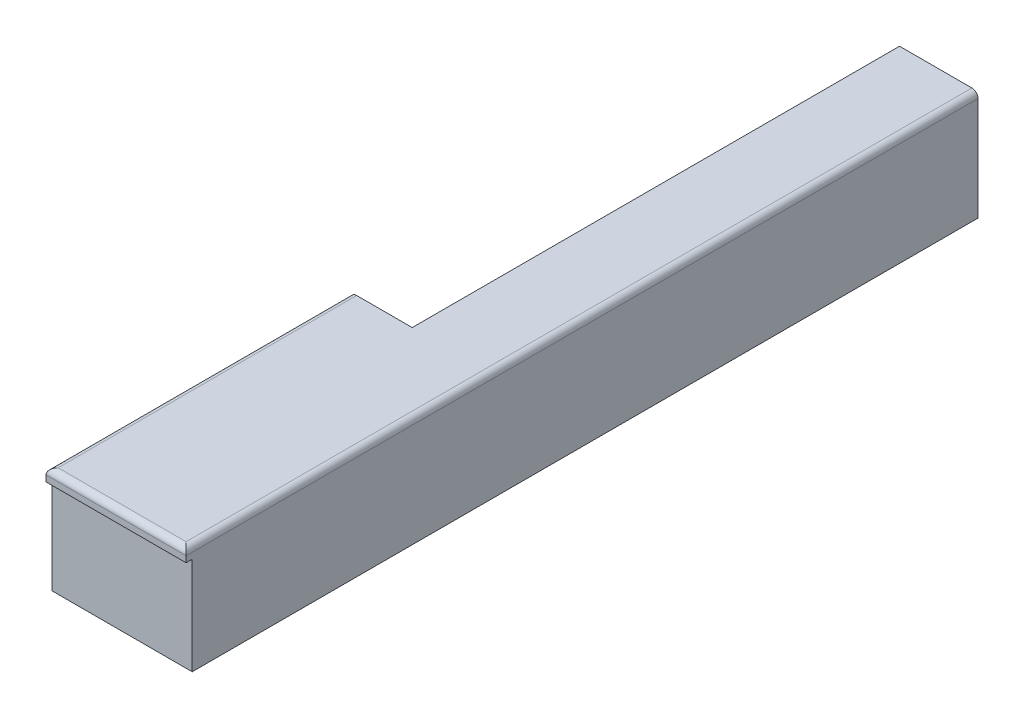
ISO-10303-21;
HEADER;
FILE_DESCRIPTION(('STEP AP214'),'2;1');
FILE_NAME('part.step','',(''),(''),'','','');
FILE_SCHEMA(('AUTOMOTIVE_DESIGN { 1 0 10303 214 1 1 1 1 }'));
ENDSEC;
DATA;
#1=APPLICATION_CONTEXT('core data for automotive mechanical design processes');
#2=APPLICATION_PROTOCOL_DEFINITION('international standard','automotive_design',2000,#1);
#3=PRODUCT_CONTEXT('',#1,'mechanical');
#4=PRODUCT('Part','Part','',(#3));
#5=PRODUCT_RELATED_PRODUCT_CATEGORY('part','',(#4));
#6=PRODUCT_DEFINITION_FORMATION('','',#4);
#7=PRODUCT_DEFINITION_CONTEXT('part definition',#1,'design');
#8=PRODUCT_DEFINITION('design','',#6,#7);
#9=PRODUCT_DEFINITION_SHAPE('','',#8);
#10=(LENGTH_UNIT() NAMED_UNIT(*) SI_UNIT(.MILLI.,.METRE.));
#11=(NAMED_UNIT(*) PLANE_ANGLE_UNIT() SI_UNIT($,.RADIAN.));
#12=(NAMED_UNIT(*) SI_UNIT($,.STERADIAN.) SOLID_ANGLE_UNIT());
#13=UNCERTAINTY_MEASURE_WITH_UNIT(LENGTH_MEASURE(1.E-05),#10,'distance_accuracy_value','');
#14=(GEOMETRIC_REPRESENTATION_CONTEXT(3) GLOBAL_UNCERTAINTY_ASSIGNED_CONTEXT((#13)) GLOBAL_UNIT_ASSIGNED_CONTEXT((#10,
#11,#12)) REPRESENTATION_CONTEXT('',''));
#15=CARTESIAN_POINT('',(0.,0.,0.));
#16=DIRECTION('',(0.,0.,1.));
#17=DIRECTION('',(1.,0.,0.));
#18=AXIS2_PLACEMENT_3D('',#15,#16,#17);
#19=CARTESIAN_POINT('',(0.,18.,-130.));
#20=DIRECTION('',(0.,0.,-1.));
#21=DIRECTION('',(-1.,0.,0.));
#22=AXIS2_PLACEMENT_3D('',#19,#20,#21);
#23=PLANE('',#22);
#24=DIRECTION('',(1.,0.,0.));
#25=VECTOR('',#24,1.);
#26=CARTESIAN_POINT('',(0.,18.,-130.));
#27=LINE('',#26,#25);
#28=CARTESIAN_POINT('',(10.12,18.,-130.));
#29=VERTEX_POINT('',#28);
#30=CARTESIAN_POINT('',(22.,18.,-130.));
#31=VERTEX_POINT('',#30);
#32=EDGE_CURVE('E140',#29,#31,#27,.T.);
#33=ORIENTED_EDGE('',*,*,#32,.T.);
#34=CARTESIAN_POINT('',(22.,17.,-130.));
#35=DIRECTION('',(0.,0.,-1.));
#36=DIRECTION('',(-1.,0.,0.));
#37=AXIS2_PLACEMENT_3D('',#34,#35,#36);
#38=CIRCLE('',#37,1.);
#39=CARTESIAN_POINT('',(23.,17.,-130.));
#40=VERTEX_POINT('',#39);
#41=EDGE_CURVE('E170',#31,#40,#38,.T.);
#42=ORIENTED_EDGE('',*,*,#41,.T.);
#43=DIRECTION('',(0.,-1.,0.));
#44=VECTOR('',#43,1.);
#45=CARTESIAN_POINT('',(23.,18.,-130.));
#46=LINE('',#45,#44);
#47=CARTESIAN_POINT('',(23.,0.,-130.));
#48=VERTEX_POINT('',#47);
#49=EDGE_CURVE('E150',#40,#48,#46,.T.);
#50=ORIENTED_EDGE('',*,*,#49,.T.);
#51=DIRECTION('',(1.,0.,0.));
#52=VECTOR('',#51,1.);
#53=CARTESIAN_POINT('',(0.,0.,-130.));
#54=LINE('',#53,#52);
#55=CARTESIAN_POINT('',(10.12,0.,-130.));
#56=VERTEX_POINT('',#55);
#57=EDGE_CURVE('E139',#56,#48,#54,.T.);
#58=ORIENTED_EDGE('',*,*,#57,.F.);
#59=DIRECTION('',(0.,-1.,0.));
#60=VECTOR('',#59,1.);
#61=CARTESIAN_POINT('',(10.12,18.,-130.));
#62=LINE('',#61,#60);
#63=EDGE_CURVE('E161',#29,#56,#62,.T.);
#64=ORIENTED_EDGE('',*,*,#63,.F.);
#65=EDGE_LOOP('',(#33,#42,#50,#58,#64));
#66=FACE_BOUND('',#65,.T.);
#67=ADVANCED_FACE('F35',(#66),#23,.T.);
#68=CARTESIAN_POINT('',(10.12,18.,0.));
#69=DIRECTION('',(1.,0.,0.));
#70=DIRECTION('',(0.,0.,-1.));
#71=AXIS2_PLACEMENT_3D('',#68,#69,#70);
#72=PLANE('',#71);
#73=DIRECTION('',(0.,0.,1.));
#74=VECTOR('',#73,1.);
#75=CARTESIAN_POINT('',(10.12,0.,0.));
#76=LINE('',#75,#74);
#77=CARTESIAN_POINT('',(10.12,0.,-50.));
#78=VERTEX_POINT('',#77);
#79=EDGE_CURVE('E201',#56,#78,#76,.T.);
#80=ORIENTED_EDGE('',*,*,#79,.T.);
#81=DIRECTION('',(0.,-1.,0.));
#82=VECTOR('',#81,1.);
#83=CARTESIAN_POINT('',(10.12,18.,-50.));
#84=LINE('',#83,#82);
#85=CARTESIAN_POINT('',(10.12,18.,-50.));
#86=VERTEX_POINT('',#85);
#87=EDGE_CURVE('E159',#86,#78,#84,.T.);
#88=ORIENTED_EDGE('',*,*,#87,.F.);
#89=DIRECTION('',(0.,0.,1.));
#90=VECTOR('',#89,1.);
#91=CARTESIAN_POINT('',(10.12,18.,0.));
#92=LINE('',#91,#90);
#93=EDGE_CURVE('E144',#29,#86,#92,.T.);
#94=ORIENTED_EDGE('',*,*,#93,.F.);
#95=ORIENTED_EDGE('',*,*,#63,.T.);
#96=EDGE_LOOP('',(#80,#88,#94,#95));
#97=FACE_BOUND('',#96,.T.);
#98=ADVANCED_FACE('F212',(#97),#72,.F.);
#99=CARTESIAN_POINT('',(0.,18.,-50.));
#100=DIRECTION('',(0.,0.,-1.));
#101=DIRECTION('',(-1.,0.,0.));
#102=AXIS2_PLACEMENT_3D('',#99,#100,#101);
#103=PLANE('',#102);
#104=DIRECTION('',(0.,-1.,0.));
#105=VECTOR('',#104,1.);
#106=CARTESIAN_POINT('',(0.,18.,-50.));
#107=LINE('',#106,#105);
#108=CARTESIAN_POINT('',(0.,17.,-50.));
#109=VERTEX_POINT('',#108);
#110=CARTESIAN_POINT('',(0.,0.,-50.));
#111=VERTEX_POINT('',#110);
#112=EDGE_CURVE('E157',#109,#111,#107,.T.);
#113=ORIENTED_EDGE('',*,*,#112,.F.);
#114=CARTESIAN_POINT('',(1.,17.,-50.));
#115=DIRECTION('',(0.,0.,-1.));
#116=DIRECTION('',(-1.,0.,0.));
#117=AXIS2_PLACEMENT_3D('',#114,#115,#116);
#118=CIRCLE('',#117,1.);
#119=CARTESIAN_POINT('',(1.,18.,-50.));
#120=VERTEX_POINT('',#119);
#121=EDGE_CURVE('E44',#109,#120,#118,.T.);
#122=ORIENTED_EDGE('',*,*,#121,.T.);
#123=DIRECTION('',(1.,0.,0.));
#124=VECTOR('',#123,1.);
#125=CARTESIAN_POINT('',(0.,18.,-50.));
#126=LINE('',#125,#124);
#127=EDGE_CURVE('E153',#120,#86,#126,.T.);
#128=ORIENTED_EDGE('',*,*,#127,.T.);
#129=ORIENTED_EDGE('',*,*,#87,.T.);
#130=DIRECTION('',(1.,0.,0.));
#131=VECTOR('',#130,1.);
#132=CARTESIAN_POINT('',(0.,0.,-50.));
#133=LINE('',#132,#131);
#134=EDGE_CURVE('E146',#111,#78,#133,.T.);
#135=ORIENTED_EDGE('',*,*,#134,.F.);
#136=EDGE_LOOP('',(#113,#122,#128,#129,#135));
#137=FACE_BOUND('',#136,.T.);
#138=ADVANCED_FACE('F206',(#137),#103,.T.);
#139=CARTESIAN_POINT('',(0.,18.,0.));
#140=DIRECTION('',(-1.,0.,0.));
#141=DIRECTION('',(0.,0.,1.));
#142=AXIS2_PLACEMENT_3D('',#139,#140,#141);
#143=PLANE('',#142);
#144=DIRECTION('',(0.,-1.,0.));
#145=VECTOR('',#144,1.);
#146=CARTESIAN_POINT('',(0.,18.,0.));
#147=LINE('',#146,#145);
#148=CARTESIAN_POINT('',(0.,17.,0.));
#149=VERTEX_POINT('',#148);
#150=CARTESIAN_POINT('',(0.,16.,0.));
#151=VERTEX_POINT('',#150);
#152=EDGE_CURVE('E155',#149,#151,#147,.T.);
#153=ORIENTED_EDGE('',*,*,#152,.F.);
#154=DIRECTION('',(0.,0.,-1.));
#155=VECTOR('',#154,1.);
#156=CARTESIAN_POINT('',(0.,17.,0.));
#157=LINE('',#156,#155);
#158=EDGE_CURVE('E52',#149,#109,#157,.T.);
#159=ORIENTED_EDGE('',*,*,#158,.T.);
#160=ORIENTED_EDGE('',*,*,#112,.T.);
#161=DIRECTION('',(0.,0.,-1.));
#162=VECTOR('',#161,1.);
#163=CARTESIAN_POINT('',(0.,0.,0.));
#164=LINE('',#163,#162);
#165=CARTESIAN_POINT('',(0.,0.,-1.));
#166=VERTEX_POINT('',#165);
#167=EDGE_CURVE('E141',#166,#111,#164,.T.);
#168=ORIENTED_EDGE('',*,*,#167,.F.);
#169=DIRECTION('',(0.,-1.,0.));
#170=VECTOR('',#169,1.);
#171=CARTESIAN_POINT('',(0.,0.,-1.));
#172=LINE('',#171,#170);
#173=CARTESIAN_POINT('',(0.,16.,-1.));
#174=VERTEX_POINT('',#173);
#175=EDGE_CURVE('E119',#174,#166,#172,.T.);
#176=ORIENTED_EDGE('',*,*,#175,.F.);
#177=DIRECTION('',(0.,0.,1.));
#178=VECTOR('',#177,1.);
#179=CARTESIAN_POINT('',(0.,16.,-1.));
#180=LINE('',#179,#178);
#181=EDGE_CURVE('E194',#174,#151,#180,.T.);
#182=ORIENTED_EDGE('',*,*,#181,.T.);
#183=EDGE_LOOP('',(#153,#159,#160,#168,#176,#182));
#184=FACE_BOUND('',#183,.T.);
#185=ADVANCED_FACE('F236',(#184),#143,.T.);
#186=CARTESIAN_POINT('',(0.,18.,0.));
#187=DIRECTION('',(0.,0.,-1.));
#188=DIRECTION('',(-1.,0.,0.));
#189=AXIS2_PLACEMENT_3D('',#186,#187,#188);
#190=PLANE('',#189);
#191=DIRECTION('',(0.,-1.,0.));
#192=VECTOR('',#191,1.);
#193=CARTESIAN_POINT('',(23.,18.,0.));
#194=LINE('',#193,#192);
#195=CARTESIAN_POINT('',(23.,17.,0.));
#196=VERTEX_POINT('',#195);
#197=CARTESIAN_POINT('',(23.,16.,0.));
#198=VERTEX_POINT('',#197);
#199=EDGE_CURVE('E152',#196,#198,#194,.T.);
#200=ORIENTED_EDGE('',*,*,#199,.F.);
#201=DIRECTION('',(1.,0.,0.));
#202=VECTOR('',#201,1.);
#203=CARTESIAN_POINT('',(0.,17.,0.));
#204=LINE('',#203,#202);
#205=EDGE_CURVE('E11',#196,#149,#204,.F.);
#206=ORIENTED_EDGE('',*,*,#205,.T.);
#207=ORIENTED_EDGE('',*,*,#152,.T.);
#208=DIRECTION('',(-1.,0.,0.));
#209=VECTOR('',#208,1.);
#210=CARTESIAN_POINT('',(0.,16.,0.));
#211=LINE('',#210,#209);
#212=EDGE_CURVE('E182',#198,#151,#211,.T.);
#213=ORIENTED_EDGE('',*,*,#212,.F.);
#214=EDGE_LOOP('',(#200,#206,#207,#213));
#215=FACE_BOUND('',#214,.T.);
#216=ADVANCED_FACE('F239',(#215),#190,.F.);
#217=CARTESIAN_POINT('',(23.,18.,0.));
#218=DIRECTION('',(-1.,0.,0.));
#219=DIRECTION('',(0.,0.,1.));
#220=AXIS2_PLACEMENT_3D('',#217,#218,#219);
#221=PLANE('',#220);
#222=ORIENTED_EDGE('',*,*,#49,.F.);
#223=DIRECTION('',(0.,0.,-1.));
#224=VECTOR('',#223,1.);
#225=CARTESIAN_POINT('',(23.,17.,0.));
#226=LINE('',#225,#224);
#227=EDGE_CURVE('E172',#40,#196,#226,.F.);
#228=ORIENTED_EDGE('',*,*,#227,.T.);
#229=ORIENTED_EDGE('',*,*,#199,.T.);
#230=DIRECTION('',(0.,0.,1.));
#231=VECTOR('',#230,1.);
#232=CARTESIAN_POINT('',(23.,16.,-1.));
#233=LINE('',#232,#231);
#234=CARTESIAN_POINT('',(23.,16.,-1.));
#235=VERTEX_POINT('',#234);
#236=EDGE_CURVE('E133',#235,#198,#233,.T.);
#237=ORIENTED_EDGE('',*,*,#236,.F.);
#238=DIRECTION('',(0.,1.,0.));
#239=VECTOR('',#238,1.);
#240=CARTESIAN_POINT('',(23.,0.,-1.));
#241=LINE('',#240,#239);
#242=CARTESIAN_POINT('',(23.,0.,-1.));
#243=VERTEX_POINT('',#242);
#244=EDGE_CURVE('E116',#243,#235,#241,.T.);
#245=ORIENTED_EDGE('',*,*,#244,.F.);
#246=DIRECTION('',(0.,0.,-1.));
#247=VECTOR('',#246,1.);
#248=CARTESIAN_POINT('',(23.,0.,0.));
#249=LINE('',#248,#247);
#250=EDGE_CURVE('E130',#243,#48,#249,.T.);
#251=ORIENTED_EDGE('',*,*,#250,.T.);
#252=EDGE_LOOP('',(#222,#228,#229,#237,#245,#251));
#253=FACE_BOUND('',#252,.T.);
#254=ADVANCED_FACE('F129',(#253),#221,.F.);
#255=CARTESIAN_POINT('',(0.,18.,0.));
#256=DIRECTION('',(0.,1.,0.));
#257=DIRECTION('',(0.,0.,1.));
#258=AXIS2_PLACEMENT_3D('',#255,#256,#257);
#259=PLANE('',#258);
#260=DIRECTION('',(1.,0.,0.));
#261=VECTOR('',#260,1.);
#262=CARTESIAN_POINT('',(23.,18.,-1.));
#263=LINE('',#262,#261);
#264=CARTESIAN_POINT('',(1.,18.,-1.));
#265=VERTEX_POINT('',#264);
#266=CARTESIAN_POINT('',(22.,18.,-1.));
#267=VERTEX_POINT('',#266);
#268=EDGE_CURVE('E163',#265,#267,#263,.T.);
#269=ORIENTED_EDGE('',*,*,#268,.T.);
#270=DIRECTION('',(0.,0.,-1.));
#271=VECTOR('',#270,1.);
#272=CARTESIAN_POINT('',(22.,18.,-130.));
#273=LINE('',#272,#271);
#274=EDGE_CURVE('E167',#267,#31,#273,.T.);
#275=ORIENTED_EDGE('',*,*,#274,.T.);
#276=ORIENTED_EDGE('',*,*,#32,.F.);
#277=ORIENTED_EDGE('',*,*,#93,.T.);
#278=ORIENTED_EDGE('',*,*,#127,.F.);
#279=DIRECTION('',(0.,0.,-1.));
#280=VECTOR('',#279,1.);
#281=CARTESIAN_POINT('',(1.,18.,0.));
#282=LINE('',#281,#280);
#283=EDGE_CURVE('E165',#120,#265,#282,.F.);
#284=ORIENTED_EDGE('',*,*,#283,.T.);
#285=EDGE_LOOP('',(#269,#275,#276,#277,#278,#284));
#286=FACE_BOUND('',#285,.T.);
#287=ADVANCED_FACE('F217',(#286),#259,.T.);
#288=CARTESIAN_POINT('',(0.,0.,0.));
#289=DIRECTION('',(0.,1.,0.));
#290=DIRECTION('',(0.,0.,1.));
#291=AXIS2_PLACEMENT_3D('',#288,#289,#290);
#292=PLANE('',#291);
#293=ORIENTED_EDGE('',*,*,#250,.F.);
#294=DIRECTION('',(1.,0.,0.));
#295=VECTOR('',#294,1.);
#296=CARTESIAN_POINT('',(0.,0.,-1.));
#297=LINE('',#296,#295);
#298=EDGE_CURVE('E112',#166,#243,#297,.T.);
#299=ORIENTED_EDGE('',*,*,#298,.F.);
#300=ORIENTED_EDGE('',*,*,#167,.T.);
#301=ORIENTED_EDGE('',*,*,#134,.T.);
#302=ORIENTED_EDGE('',*,*,#79,.F.);
#303=ORIENTED_EDGE('',*,*,#57,.T.);
#304=EDGE_LOOP('',(#293,#299,#300,#301,#302,#303));
#305=FACE_BOUND('',#304,.T.);
#306=ADVANCED_FACE('F136',(#305),#292,.F.);
#307=CARTESIAN_POINT('',(0.,16.,-1.));
#308=DIRECTION('',(0.,1.,0.));
#309=DIRECTION('',(0.,0.,1.));
#310=AXIS2_PLACEMENT_3D('',#307,#308,#309);
#311=PLANE('',#310);
#312=ORIENTED_EDGE('',*,*,#212,.T.);
#313=ORIENTED_EDGE('',*,*,#181,.F.);
#314=DIRECTION('',(-1.,0.,0.));
#315=VECTOR('',#314,1.);
#316=CARTESIAN_POINT('',(0.,16.,-1.));
#317=LINE('',#316,#315);
#318=EDGE_CURVE('E134',#235,#174,#317,.T.);
#319=ORIENTED_EDGE('',*,*,#318,.F.);
#320=ORIENTED_EDGE('',*,*,#236,.T.);
#321=EDGE_LOOP('',(#312,#313,#319,#320));
#322=FACE_BOUND('',#321,.T.);
#323=ADVANCED_FACE('F246',(#322),#311,.F.);
#324=CARTESIAN_POINT('',(0.,0.,-1.));
#325=DIRECTION('',(0.,0.,-1.));
#326=DIRECTION('',(-1.,0.,0.));
#327=AXIS2_PLACEMENT_3D('',#324,#325,#326);
#328=PLANE('',#327);
#329=ORIENTED_EDGE('',*,*,#175,.T.);
#330=ORIENTED_EDGE('',*,*,#298,.T.);
#331=ORIENTED_EDGE('',*,*,#244,.T.);
#332=ORIENTED_EDGE('',*,*,#318,.T.);
#333=EDGE_LOOP('',(#329,#330,#331,#332));
#334=FACE_BOUND('',#333,.T.);
#335=ADVANCED_FACE('F114',(#334),#328,.F.);
#336=CARTESIAN_POINT('',(1.,17.,0.));
#337=DIRECTION('',(0.,0.,-1.));
#338=DIRECTION('',(-1.,0.,0.));
#339=AXIS2_PLACEMENT_3D('',#336,#337,#338);
#340=CYLINDRICAL_SURFACE('',#339,1.);
#341=ORIENTED_EDGE('',*,*,#121,.F.);
#342=ORIENTED_EDGE('',*,*,#158,.F.);
#343=CARTESIAN_POINT('',(1.,17.,-1.));
#344=DIRECTION('',(-0.707106781186547,0.,-0.707106781186547));
#345=DIRECTION('',(-0.707106781186547,0.,0.707106781186547));
#346=AXIS2_PLACEMENT_3D('',#343,#344,#345);
#347=ELLIPSE('',#346,1.41421356237309,1.);
#348=EDGE_CURVE('E39',#265,#149,#347,.F.);
#349=ORIENTED_EDGE('',*,*,#348,.F.);
#350=ORIENTED_EDGE('',*,*,#283,.F.);
#351=EDGE_LOOP('',(#341,#342,#349,#350));
#352=FACE_BOUND('',#351,.T.);
#353=ADVANCED_FACE('F37',(#352),#340,.T.);
#354=CARTESIAN_POINT('',(0.,17.,-1.));
#355=DIRECTION('',(-1.,0.,0.));
#356=DIRECTION('',(0.,0.,1.));
#357=AXIS2_PLACEMENT_3D('',#354,#355,#356);
#358=CYLINDRICAL_SURFACE('',#357,1.);
#359=ORIENTED_EDGE('',*,*,#348,.T.);
#360=ORIENTED_EDGE('',*,*,#205,.F.);
#361=CARTESIAN_POINT('',(22.,17.,-1.));
#362=DIRECTION('',(-0.707106781186547,0.,0.707106781186548));
#363=DIRECTION('',(-0.707106781186548,0.,-0.707106781186547));
#364=AXIS2_PLACEMENT_3D('',#361,#362,#363);
#365=ELLIPSE('',#364,1.4142135623731,1.);
#366=EDGE_CURVE('E175',#267,#196,#365,.F.);
#367=ORIENTED_EDGE('',*,*,#366,.F.);
#368=ORIENTED_EDGE('',*,*,#268,.F.);
#369=EDGE_LOOP('',(#359,#360,#367,#368));
#370=FACE_BOUND('',#369,.T.);
#371=ADVANCED_FACE('F219',(#370),#358,.T.);
#372=CARTESIAN_POINT('',(22.,17.,0.));
#373=DIRECTION('',(0.,0.,1.));
#374=DIRECTION('',(1.,0.,0.));
#375=AXIS2_PLACEMENT_3D('',#372,#373,#374);
#376=CYLINDRICAL_SURFACE('',#375,1.);
#377=ORIENTED_EDGE('',*,*,#366,.T.);
#378=ORIENTED_EDGE('',*,*,#227,.F.);
#379=ORIENTED_EDGE('',*,*,#41,.F.);
#380=ORIENTED_EDGE('',*,*,#274,.F.);
#381=EDGE_LOOP('',(#377,#378,#379,#380));
#382=FACE_BOUND('',#381,.T.);
#383=ADVANCED_FACE('F215',(#382),#376,.T.);
#384=CLOSED_SHELL('',(#67,#98,#138,#185,#216,#254,#287,#306,#323,#335,#353,#371,#383));
#385=MANIFOLD_SOLID_BREP('B2',#384);
#386=ADVANCED_BREP_SHAPE_REPRESENTATION('',(#18,#385),#14);
#387=SHAPE_DEFINITION_REPRESENTATION(#9,#386);
ENDSEC;
END-ISO-10303-21;
